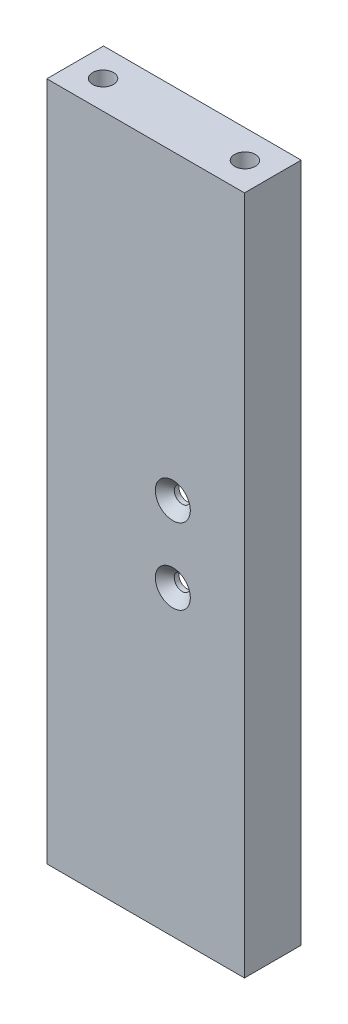
ISO-10303-21;
HEADER;
FILE_DESCRIPTION(('STEP AP214'),'2;1');
FILE_NAME('part.step','',(''),(''),'','','');
FILE_SCHEMA(('AUTOMOTIVE_DESIGN { 1 0 10303 214 1 1 1 1 }'));
ENDSEC;
DATA;
#1=APPLICATION_CONTEXT('core data for automotive mechanical design processes');
#2=APPLICATION_PROTOCOL_DEFINITION('international standard','automotive_design',2000,#1);
#3=PRODUCT_CONTEXT('',#1,'mechanical');
#4=PRODUCT('Part','Part','',(#3));
#5=PRODUCT_RELATED_PRODUCT_CATEGORY('part','',(#4));
#6=PRODUCT_DEFINITION_FORMATION('','',#4);
#7=PRODUCT_DEFINITION_CONTEXT('part definition',#1,'design');
#8=PRODUCT_DEFINITION('design','',#6,#7);
#9=PRODUCT_DEFINITION_SHAPE('','',#8);
#10=(LENGTH_UNIT() NAMED_UNIT(*) SI_UNIT(.MILLI.,.METRE.));
#11=(NAMED_UNIT(*) PLANE_ANGLE_UNIT() SI_UNIT($,.RADIAN.));
#12=(NAMED_UNIT(*) SI_UNIT($,.STERADIAN.) SOLID_ANGLE_UNIT());
#13=UNCERTAINTY_MEASURE_WITH_UNIT(LENGTH_MEASURE(1.E-05),#10,'distance_accuracy_value','');
#14=(GEOMETRIC_REPRESENTATION_CONTEXT(3) GLOBAL_UNCERTAINTY_ASSIGNED_CONTEXT((#13)) GLOBAL_UNIT_ASSIGNED_CONTEXT((#10,
#11,#12)) REPRESENTATION_CONTEXT('',''));
#15=CARTESIAN_POINT('',(0.,0.,0.));
#16=DIRECTION('',(0.,0.,1.));
#17=DIRECTION('',(1.,0.,0.));
#18=AXIS2_PLACEMENT_3D('',#15,#16,#17);
#19=CARTESIAN_POINT('',(0.,0.,-12.));
#20=DIRECTION('',(0.,0.,-1.));
#21=DIRECTION('',(-1.,0.,0.));
#22=AXIS2_PLACEMENT_3D('',#19,#20,#21);
#23=PLANE('',#22);
#24=DIRECTION('',(0.,-1.,0.));
#25=VECTOR('',#24,1.);
#26=CARTESIAN_POINT('',(-20.9,0.,-12.));
#27=LINE('',#26,#25);
#28=CARTESIAN_POINT('',(-20.9000000000001,143.8,-12.));
#29=VERTEX_POINT('',#28);
#30=CARTESIAN_POINT('',(-20.9,0.,-12.));
#31=VERTEX_POINT('',#30);
#32=EDGE_CURVE('E160',#29,#31,#27,.T.);
#33=ORIENTED_EDGE('',*,*,#32,.F.);
#34=DIRECTION('',(-1.,0.,0.));
#35=VECTOR('',#34,1.);
#36=CARTESIAN_POINT('',(-20.9000000000001,143.8,-12.));
#37=LINE('',#36,#35);
#38=CARTESIAN_POINT('',(20.9,143.8,-12.));
#39=VERTEX_POINT('',#38);
#40=EDGE_CURVE('E168',#39,#29,#37,.T.);
#41=ORIENTED_EDGE('',*,*,#40,.F.);
#42=DIRECTION('',(0.,1.,0.));
#43=VECTOR('',#42,1.);
#44=CARTESIAN_POINT('',(20.9,0.,-12.));
#45=LINE('',#44,#43);
#46=CARTESIAN_POINT('',(20.9,0.,-12.));
#47=VERTEX_POINT('',#46);
#48=EDGE_CURVE('E165',#47,#39,#45,.T.);
#49=ORIENTED_EDGE('',*,*,#48,.F.);
#50=DIRECTION('',(1.,0.,0.));
#51=VECTOR('',#50,1.);
#52=CARTESIAN_POINT('',(-20.9,0.,-12.));
#53=LINE('',#52,#51);
#54=EDGE_CURVE('E162',#31,#47,#53,.T.);
#55=ORIENTED_EDGE('',*,*,#54,.F.);
#56=EDGE_LOOP('',(#33,#41,#49,#55));
#57=FACE_BOUND('',#56,.T.);
#58=DIRECTION('',(-1.,0.,0.));
#59=VECTOR('',#58,1.);
#60=CARTESIAN_POINT('',(-20.9000000000001,136.8,-12.));
#61=LINE('',#60,#59);
#62=CARTESIAN_POINT('',(13.9,136.8,-12.));
#63=VERTEX_POINT('',#62);
#64=CARTESIAN_POINT('',(-13.9000000000001,136.8,-12.));
#65=VERTEX_POINT('',#64);
#66=EDGE_CURVE('E155',#63,#65,#61,.T.);
#67=ORIENTED_EDGE('',*,*,#66,.T.);
#68=DIRECTION('',(0.,-1.,0.));
#69=VECTOR('',#68,1.);
#70=CARTESIAN_POINT('',(-13.9,0.,-12.));
#71=LINE('',#70,#69);
#72=CARTESIAN_POINT('',(-13.9,7.,-12.));
#73=VERTEX_POINT('',#72);
#74=EDGE_CURVE('E123',#65,#73,#71,.T.);
#75=ORIENTED_EDGE('',*,*,#74,.T.);
#76=DIRECTION('',(1.,0.,0.));
#77=VECTOR('',#76,1.);
#78=CARTESIAN_POINT('',(-20.9,7.,-12.));
#79=LINE('',#78,#77);
#80=CARTESIAN_POINT('',(13.9,7.00000000000001,-12.));
#81=VERTEX_POINT('',#80);
#82=EDGE_CURVE('E145',#73,#81,#79,.T.);
#83=ORIENTED_EDGE('',*,*,#82,.T.);
#84=DIRECTION('',(0.,1.,0.));
#85=VECTOR('',#84,1.);
#86=CARTESIAN_POINT('',(13.9,0.,-12.));
#87=LINE('',#86,#85);
#88=EDGE_CURVE('E59',#81,#63,#87,.T.);
#89=ORIENTED_EDGE('',*,*,#88,.T.);
#90=EDGE_LOOP('',(#67,#75,#83,#89));
#91=FACE_BOUND('',#90,.T.);
#92=ADVANCED_FACE('F43',(#57,#91),#23,.T.);
#93=CARTESIAN_POINT('',(-20.9,0.,-12.));
#94=DIRECTION('',(-1.,0.,0.));
#95=DIRECTION('',(0.,-1.,0.));
#96=AXIS2_PLACEMENT_3D('',#93,#94,#95);
#97=PLANE('',#96);
#98=CARTESIAN_POINT('',(-20.9,129.4,-6.00000000000002));
#99=DIRECTION('',(-1.,0.,0.));
#100=DIRECTION('',(0.,0.,1.));
#101=AXIS2_PLACEMENT_3D('',#98,#99,#100);
#102=CIRCLE('',#101,2.20000000000001);
#103=CARTESIAN_POINT('',(-20.9,129.4,-3.80000000000001));
#104=VERTEX_POINT('',#103);
#105=EDGE_CURVE('E258',#104,#104,#102,.T.);
#106=ORIENTED_EDGE('',*,*,#105,.F.);
#107=EDGE_LOOP('',(#106));
#108=FACE_BOUND('',#107,.T.);
#109=CARTESIAN_POINT('',(-20.9,14.4000000000001,-6.));
#110=DIRECTION('',(-1.,0.,0.));
#111=DIRECTION('',(0.,0.,1.));
#112=AXIS2_PLACEMENT_3D('',#109,#110,#111);
#113=CIRCLE('',#112,2.2);
#114=CARTESIAN_POINT('',(-20.9,14.4000000000001,-3.8));
#115=VERTEX_POINT('',#114);
#116=EDGE_CURVE('E261',#115,#115,#113,.T.);
#117=ORIENTED_EDGE('',*,*,#116,.F.);
#118=EDGE_LOOP('',(#117));
#119=FACE_BOUND('',#118,.T.);
#120=DIRECTION('',(0.,-1.,0.));
#121=VECTOR('',#120,1.);
#122=CARTESIAN_POINT('',(-20.9,0.,0.));
#123=LINE('',#122,#121);
#124=CARTESIAN_POINT('',(-20.9000000000001,143.8,0.));
#125=VERTEX_POINT('',#124);
#126=CARTESIAN_POINT('',(-20.9,0.,0.));
#127=VERTEX_POINT('',#126);
#128=EDGE_CURVE('E128',#125,#127,#123,.T.);
#129=ORIENTED_EDGE('',*,*,#128,.F.);
#130=DIRECTION('',(0.,0.,1.));
#131=VECTOR('',#130,1.);
#132=CARTESIAN_POINT('',(-20.9000000000001,143.8,-12.));
#133=LINE('',#132,#131);
#134=EDGE_CURVE('E68',#29,#125,#133,.T.);
#135=ORIENTED_EDGE('',*,*,#134,.F.);
#136=ORIENTED_EDGE('',*,*,#32,.T.);
#137=DIRECTION('',(0.,0.,1.));
#138=VECTOR('',#137,1.);
#139=CARTESIAN_POINT('',(-20.9,0.,-12.));
#140=LINE('',#139,#138);
#141=EDGE_CURVE('E94',#31,#127,#140,.T.);
#142=ORIENTED_EDGE('',*,*,#141,.T.);
#143=EDGE_LOOP('',(#129,#135,#136,#142));
#144=FACE_BOUND('',#143,.T.);
#145=ADVANCED_FACE('F209',(#108,#119,#144),#97,.T.);
#146=CARTESIAN_POINT('',(-20.9000000000001,143.8,-12.));
#147=DIRECTION('',(0.,1.,0.));
#148=DIRECTION('',(0.,0.,1.));
#149=AXIS2_PLACEMENT_3D('',#146,#147,#148);
#150=PLANE('',#149);
#151=CARTESIAN_POINT('',(15.,143.8,-6.00000000000045));
#152=DIRECTION('',(0.,1.,0.));
#153=DIRECTION('',(0.,0.,1.));
#154=AXIS2_PLACEMENT_3D('',#151,#152,#153);
#155=CIRCLE('',#154,2.2);
#156=CARTESIAN_POINT('',(15.,143.8,-3.80000000000044));
#157=VERTEX_POINT('',#156);
#158=EDGE_CURVE('E287',#157,#157,#155,.T.);
#159=ORIENTED_EDGE('',*,*,#158,.F.);
#160=EDGE_LOOP('',(#159));
#161=FACE_BOUND('',#160,.T.);
#162=CARTESIAN_POINT('',(-15.,143.8,-6.00000000000044));
#163=DIRECTION('',(0.,1.,0.));
#164=DIRECTION('',(0.,0.,1.));
#165=AXIS2_PLACEMENT_3D('',#162,#163,#164);
#166=CIRCLE('',#165,2.2);
#167=CARTESIAN_POINT('',(-15.,143.8,-3.80000000000044));
#168=VERTEX_POINT('',#167);
#169=EDGE_CURVE('E290',#168,#168,#166,.T.);
#170=ORIENTED_EDGE('',*,*,#169,.F.);
#171=EDGE_LOOP('',(#170));
#172=FACE_BOUND('',#171,.T.);
#173=DIRECTION('',(-1.,0.,0.));
#174=VECTOR('',#173,1.);
#175=CARTESIAN_POINT('',(-20.9000000000001,143.8,0.));
#176=LINE('',#175,#174);
#177=CARTESIAN_POINT('',(20.9,143.8,0.));
#178=VERTEX_POINT('',#177);
#179=EDGE_CURVE('E163',#178,#125,#176,.T.);
#180=ORIENTED_EDGE('',*,*,#179,.F.);
#181=DIRECTION('',(0.,0.,1.));
#182=VECTOR('',#181,1.);
#183=CARTESIAN_POINT('',(20.9,143.8,-12.));
#184=LINE('',#183,#182);
#185=EDGE_CURVE('E182',#39,#178,#184,.T.);
#186=ORIENTED_EDGE('',*,*,#185,.F.);
#187=ORIENTED_EDGE('',*,*,#40,.T.);
#188=ORIENTED_EDGE('',*,*,#134,.T.);
#189=EDGE_LOOP('',(#180,#186,#187,#188));
#190=FACE_BOUND('',#189,.T.);
#191=ADVANCED_FACE('F214',(#161,#172,#190),#150,.T.);
#192=CARTESIAN_POINT('',(20.9,0.,-12.));
#193=DIRECTION('',(1.,0.,0.));
#194=DIRECTION('',(0.,1.,0.));
#195=AXIS2_PLACEMENT_3D('',#192,#193,#194);
#196=PLANE('',#195);
#197=DIRECTION('',(0.,1.,0.));
#198=VECTOR('',#197,1.);
#199=CARTESIAN_POINT('',(20.9,0.,0.));
#200=LINE('',#199,#198);
#201=CARTESIAN_POINT('',(20.9,0.,0.));
#202=VERTEX_POINT('',#201);
#203=EDGE_CURVE('E175',#202,#178,#200,.T.);
#204=ORIENTED_EDGE('',*,*,#203,.F.);
#205=DIRECTION('',(0.,0.,1.));
#206=VECTOR('',#205,1.);
#207=CARTESIAN_POINT('',(20.9,0.,-12.));
#208=LINE('',#207,#206);
#209=EDGE_CURVE('E184',#47,#202,#208,.T.);
#210=ORIENTED_EDGE('',*,*,#209,.F.);
#211=ORIENTED_EDGE('',*,*,#48,.T.);
#212=ORIENTED_EDGE('',*,*,#185,.T.);
#213=EDGE_LOOP('',(#204,#210,#211,#212));
#214=FACE_BOUND('',#213,.T.);
#215=ADVANCED_FACE('F213',(#214),#196,.T.);
#216=CARTESIAN_POINT('',(-20.9,0.,-12.));
#217=DIRECTION('',(0.,-1.,0.));
#218=DIRECTION('',(1.,0.,0.));
#219=AXIS2_PLACEMENT_3D('',#216,#217,#218);
#220=PLANE('',#219);
#221=CARTESIAN_POINT('',(15.,0.,-6.00000000000045));
#222=DIRECTION('',(0.,1.,0.));
#223=DIRECTION('',(0.,0.,1.));
#224=AXIS2_PLACEMENT_3D('',#221,#222,#223);
#225=CIRCLE('',#224,2.2);
#226=CARTESIAN_POINT('',(15.,0.,-3.80000000000044));
#227=VERTEX_POINT('',#226);
#228=EDGE_CURVE('E276',#227,#227,#225,.T.);
#229=ORIENTED_EDGE('',*,*,#228,.T.);
#230=EDGE_LOOP('',(#229));
#231=FACE_BOUND('',#230,.T.);
#232=CARTESIAN_POINT('',(-15.,0.,-6.00000000000044));
#233=DIRECTION('',(0.,1.,0.));
#234=DIRECTION('',(0.,0.,1.));
#235=AXIS2_PLACEMENT_3D('',#232,#233,#234);
#236=CIRCLE('',#235,2.2);
#237=CARTESIAN_POINT('',(-15.,0.,-3.80000000000044));
#238=VERTEX_POINT('',#237);
#239=EDGE_CURVE('E282',#238,#238,#236,.T.);
#240=ORIENTED_EDGE('',*,*,#239,.T.);
#241=EDGE_LOOP('',(#240));
#242=FACE_BOUND('',#241,.T.);
#243=DIRECTION('',(1.,0.,0.));
#244=VECTOR('',#243,1.);
#245=CARTESIAN_POINT('',(-20.9,0.,0.));
#246=LINE('',#245,#244);
#247=EDGE_CURVE('E172',#127,#202,#246,.T.);
#248=ORIENTED_EDGE('',*,*,#247,.F.);
#249=ORIENTED_EDGE('',*,*,#141,.F.);
#250=ORIENTED_EDGE('',*,*,#54,.T.);
#251=ORIENTED_EDGE('',*,*,#209,.T.);
#252=EDGE_LOOP('',(#248,#249,#250,#251));
#253=FACE_BOUND('',#252,.T.);
#254=ADVANCED_FACE('F205',(#231,#242,#253),#220,.T.);
#255=CARTESIAN_POINT('',(0.,0.,0.));
#256=DIRECTION('',(0.,0.,-1.));
#257=DIRECTION('',(-1.,0.,0.));
#258=AXIS2_PLACEMENT_3D('',#255,#256,#257);
#259=PLANE('',#258);
#260=CARTESIAN_POINT('',(5.75000000000001,63.9,0.));
#261=DIRECTION('',(0.,0.,-1.));
#262=DIRECTION('',(-1.,0.,0.));
#263=AXIS2_PLACEMENT_3D('',#260,#261,#262);
#264=CIRCLE('',#263,3.69999999999998);
#265=CARTESIAN_POINT('',(2.05000000000003,63.9,0.));
#266=VERTEX_POINT('',#265);
#267=EDGE_CURVE('E189',#266,#266,#264,.T.);
#268=ORIENTED_EDGE('',*,*,#267,.T.);
#269=EDGE_LOOP('',(#268));
#270=FACE_BOUND('',#269,.T.);
#271=CARTESIAN_POINT('',(5.75000000000001,79.9,0.));
#272=DIRECTION('',(0.,0.,-1.));
#273=DIRECTION('',(-1.,0.,0.));
#274=AXIS2_PLACEMENT_3D('',#271,#272,#273);
#275=CIRCLE('',#274,3.69999999999998);
#276=CARTESIAN_POINT('',(2.05000000000003,79.9,0.));
#277=VERTEX_POINT('',#276);
#278=EDGE_CURVE('E181',#277,#277,#275,.T.);
#279=ORIENTED_EDGE('',*,*,#278,.T.);
#280=EDGE_LOOP('',(#279));
#281=FACE_BOUND('',#280,.T.);
#282=ORIENTED_EDGE('',*,*,#128,.T.);
#283=ORIENTED_EDGE('',*,*,#247,.T.);
#284=ORIENTED_EDGE('',*,*,#203,.T.);
#285=ORIENTED_EDGE('',*,*,#179,.T.);
#286=EDGE_LOOP('',(#282,#283,#284,#285));
#287=FACE_BOUND('',#286,.T.);
#288=ADVANCED_FACE('F202',(#270,#281,#287),#259,.F.);
#289=CARTESIAN_POINT('',(-13.9,0.,-12.));
#290=DIRECTION('',(-1.,0.,0.));
#291=DIRECTION('',(0.,-1.,0.));
#292=AXIS2_PLACEMENT_3D('',#289,#290,#291);
#293=PLANE('',#292);
#294=DIRECTION('',(0.,-1.,0.));
#295=VECTOR('',#294,1.);
#296=CARTESIAN_POINT('',(-13.9,0.,-3.));
#297=LINE('',#296,#295);
#298=CARTESIAN_POINT('',(-13.9000000000001,136.8,-3.));
#299=VERTEX_POINT('',#298);
#300=CARTESIAN_POINT('',(-13.9,7.,-3.));
#301=VERTEX_POINT('',#300);
#302=EDGE_CURVE('E121',#299,#301,#297,.T.);
#303=ORIENTED_EDGE('',*,*,#302,.T.);
#304=DIRECTION('',(0.,0.,1.));
#305=VECTOR('',#304,1.);
#306=CARTESIAN_POINT('',(-13.9,7.,-12.));
#307=LINE('',#306,#305);
#308=EDGE_CURVE('E150',#73,#301,#307,.T.);
#309=ORIENTED_EDGE('',*,*,#308,.F.);
#310=ORIENTED_EDGE('',*,*,#74,.F.);
#311=DIRECTION('',(0.,0.,1.));
#312=VECTOR('',#311,1.);
#313=CARTESIAN_POINT('',(-13.9,136.8,-12.));
#314=LINE('',#313,#312);
#315=EDGE_CURVE('E118',#65,#299,#314,.T.);
#316=ORIENTED_EDGE('',*,*,#315,.T.);
#317=EDGE_LOOP('',(#303,#309,#310,#316));
#318=FACE_BOUND('',#317,.T.);
#319=ADVANCED_FACE('F120',(#318),#293,.F.);
#320=CARTESIAN_POINT('',(-20.9000000000001,136.8,-12.));
#321=DIRECTION('',(0.,1.,0.));
#322=DIRECTION('',(0.,0.,1.));
#323=AXIS2_PLACEMENT_3D('',#320,#321,#322);
#324=PLANE('',#323);
#325=DIRECTION('',(-1.,0.,0.));
#326=VECTOR('',#325,1.);
#327=CARTESIAN_POINT('',(-20.9000000000001,136.8,-3.));
#328=LINE('',#327,#326);
#329=CARTESIAN_POINT('',(13.9,136.8,-3.));
#330=VERTEX_POINT('',#329);
#331=EDGE_CURVE('E136',#330,#299,#328,.T.);
#332=ORIENTED_EDGE('',*,*,#331,.T.);
#333=ORIENTED_EDGE('',*,*,#315,.F.);
#334=ORIENTED_EDGE('',*,*,#66,.F.);
#335=DIRECTION('',(0.,0.,1.));
#336=VECTOR('',#335,1.);
#337=CARTESIAN_POINT('',(13.9,136.8,-12.));
#338=LINE('',#337,#336);
#339=EDGE_CURVE('E129',#63,#330,#338,.T.);
#340=ORIENTED_EDGE('',*,*,#339,.T.);
#341=EDGE_LOOP('',(#332,#333,#334,#340));
#342=FACE_BOUND('',#341,.T.);
#343=ADVANCED_FACE('F141',(#342),#324,.F.);
#344=CARTESIAN_POINT('',(13.9,0.,-12.));
#345=DIRECTION('',(1.,0.,0.));
#346=DIRECTION('',(0.,1.,0.));
#347=AXIS2_PLACEMENT_3D('',#344,#345,#346);
#348=PLANE('',#347);
#349=DIRECTION('',(0.,1.,0.));
#350=VECTOR('',#349,1.);
#351=CARTESIAN_POINT('',(13.9,0.,-3.));
#352=LINE('',#351,#350);
#353=CARTESIAN_POINT('',(13.9,7.00000000000001,-3.));
#354=VERTEX_POINT('',#353);
#355=EDGE_CURVE('E143',#354,#330,#352,.T.);
#356=ORIENTED_EDGE('',*,*,#355,.T.);
#357=ORIENTED_EDGE('',*,*,#339,.F.);
#358=ORIENTED_EDGE('',*,*,#88,.F.);
#359=DIRECTION('',(0.,0.,1.));
#360=VECTOR('',#359,1.);
#361=CARTESIAN_POINT('',(13.9,7.00000000000001,-12.));
#362=LINE('',#361,#360);
#363=EDGE_CURVE('E151',#81,#354,#362,.T.);
#364=ORIENTED_EDGE('',*,*,#363,.T.);
#365=EDGE_LOOP('',(#356,#357,#358,#364));
#366=FACE_BOUND('',#365,.T.);
#367=ADVANCED_FACE('F223',(#366),#348,.F.);
#368=CARTESIAN_POINT('',(-20.9,7.,-12.));
#369=DIRECTION('',(0.,-1.,0.));
#370=DIRECTION('',(1.,0.,0.));
#371=AXIS2_PLACEMENT_3D('',#368,#369,#370);
#372=PLANE('',#371);
#373=DIRECTION('',(1.,0.,0.));
#374=VECTOR('',#373,1.);
#375=CARTESIAN_POINT('',(-20.9,7.,-3.));
#376=LINE('',#375,#374);
#377=EDGE_CURVE('E138',#301,#354,#376,.T.);
#378=ORIENTED_EDGE('',*,*,#377,.T.);
#379=ORIENTED_EDGE('',*,*,#363,.F.);
#380=ORIENTED_EDGE('',*,*,#82,.F.);
#381=ORIENTED_EDGE('',*,*,#308,.T.);
#382=EDGE_LOOP('',(#378,#379,#380,#381));
#383=FACE_BOUND('',#382,.T.);
#384=ADVANCED_FACE('F222',(#383),#372,.F.);
#385=CARTESIAN_POINT('',(0.,0.,-3.));
#386=DIRECTION('',(0.,0.,-1.));
#387=DIRECTION('',(-1.,0.,0.));
#388=AXIS2_PLACEMENT_3D('',#385,#386,#387);
#389=PLANE('',#388);
#390=CARTESIAN_POINT('',(5.75000000000001,63.9,-3.));
#391=DIRECTION('',(0.,0.,-1.));
#392=DIRECTION('',(-1.,0.,0.));
#393=AXIS2_PLACEMENT_3D('',#390,#391,#392);
#394=CIRCLE('',#393,1.70000000000001);
#395=CARTESIAN_POINT('',(4.05000000000001,63.9,-3.));
#396=VERTEX_POINT('',#395);
#397=EDGE_CURVE('E268',#396,#396,#394,.T.);
#398=ORIENTED_EDGE('',*,*,#397,.F.);
#399=EDGE_LOOP('',(#398));
#400=FACE_BOUND('',#399,.T.);
#401=CARTESIAN_POINT('',(5.75000000000001,79.9,-3.));
#402=DIRECTION('',(0.,0.,-1.));
#403=DIRECTION('',(-1.,0.,0.));
#404=AXIS2_PLACEMENT_3D('',#401,#402,#403);
#405=CIRCLE('',#404,1.70000000000001);
#406=CARTESIAN_POINT('',(4.05000000000001,79.9,-3.));
#407=VERTEX_POINT('',#406);
#408=EDGE_CURVE('E571',#407,#407,#405,.T.);
#409=ORIENTED_EDGE('',*,*,#408,.F.);
#410=EDGE_LOOP('',(#409));
#411=FACE_BOUND('',#410,.T.);
#412=ORIENTED_EDGE('',*,*,#302,.F.);
#413=ORIENTED_EDGE('',*,*,#331,.F.);
#414=ORIENTED_EDGE('',*,*,#355,.F.);
#415=ORIENTED_EDGE('',*,*,#377,.F.);
#416=EDGE_LOOP('',(#412,#413,#414,#415));
#417=FACE_BOUND('',#416,.T.);
#418=ADVANCED_FACE('F134',(#400,#411,#417),#389,.T.);
#419=CARTESIAN_POINT('',(-15.,138.6,-6.00000000000044));
#420=DIRECTION('',(0.,1.,0.));
#421=DIRECTION('',(0.,0.,1.));
#422=AXIS2_PLACEMENT_3D('',#419,#420,#421);
#423=CYLINDRICAL_SURFACE('',#422,2.2);
#424=CARTESIAN_POINT('',(-15.,138.6,-6.00000000000044));
#425=DIRECTION('',(0.,1.,0.));
#426=DIRECTION('',(0.,0.,1.));
#427=AXIS2_PLACEMENT_3D('',#424,#425,#426);
#428=CIRCLE('',#427,2.2);
#429=CARTESIAN_POINT('',(-15.,138.6,-3.80000000000044));
#430=VERTEX_POINT('',#429);
#431=EDGE_CURVE('E275',#430,#430,#428,.T.);
#432=ORIENTED_EDGE('',*,*,#431,.F.);
#433=EDGE_LOOP('',(#432));
#434=FACE_BOUND('',#433,.T.);
#435=ORIENTED_EDGE('',*,*,#169,.T.);
#436=EDGE_LOOP('',(#435));
#437=FACE_BOUND('',#436,.T.);
#438=ADVANCED_FACE('F235',(#434,#437),#423,.F.);
#439=CARTESIAN_POINT('',(-15.,138.6,-6.00000000000044));
#440=DIRECTION('',(0.,1.,0.));
#441=DIRECTION('',(0.,0.,1.));
#442=AXIS2_PLACEMENT_3D('',#439,#440,#441);
#443=PLANE('',#442);
#444=ORIENTED_EDGE('',*,*,#431,.T.);
#445=EDGE_LOOP('',(#444));
#446=FACE_BOUND('',#445,.T.);
#447=ADVANCED_FACE('F296',(#446),#443,.T.);
#448=CARTESIAN_POINT('',(15.,138.6,-6.00000000000045));
#449=DIRECTION('',(0.,1.,0.));
#450=DIRECTION('',(0.,0.,1.));
#451=AXIS2_PLACEMENT_3D('',#448,#449,#450);
#452=CYLINDRICAL_SURFACE('',#451,2.2);
#453=CARTESIAN_POINT('',(15.,138.6,-6.00000000000045));
#454=DIRECTION('',(0.,1.,0.));
#455=DIRECTION('',(0.,0.,1.));
#456=AXIS2_PLACEMENT_3D('',#453,#454,#455);
#457=CIRCLE('',#456,2.2);
#458=CARTESIAN_POINT('',(15.,138.6,-3.80000000000044));
#459=VERTEX_POINT('',#458);
#460=EDGE_CURVE('E139',#459,#459,#457,.T.);
#461=ORIENTED_EDGE('',*,*,#460,.F.);
#462=EDGE_LOOP('',(#461));
#463=FACE_BOUND('',#462,.T.);
#464=ORIENTED_EDGE('',*,*,#158,.T.);
#465=EDGE_LOOP('',(#464));
#466=FACE_BOUND('',#465,.T.);
#467=ADVANCED_FACE('F306',(#463,#466),#452,.F.);
#468=CARTESIAN_POINT('',(15.,138.6,-6.00000000000045));
#469=DIRECTION('',(0.,1.,0.));
#470=DIRECTION('',(0.,0.,1.));
#471=AXIS2_PLACEMENT_3D('',#468,#469,#470);
#472=PLANE('',#471);
#473=ORIENTED_EDGE('',*,*,#460,.T.);
#474=EDGE_LOOP('',(#473));
#475=FACE_BOUND('',#474,.T.);
#476=ADVANCED_FACE('F364',(#475),#472,.T.);
#477=CARTESIAN_POINT('',(-15.,5.2,-6.00000000000044));
#478=DIRECTION('',(0.,-1.,0.));
#479=DIRECTION('',(0.,0.,-1.));
#480=AXIS2_PLACEMENT_3D('',#477,#478,#479);
#481=CYLINDRICAL_SURFACE('',#480,2.2);
#482=CARTESIAN_POINT('',(-15.,5.2,-6.00000000000044));
#483=DIRECTION('',(0.,1.,0.));
#484=DIRECTION('',(0.,0.,1.));
#485=AXIS2_PLACEMENT_3D('',#482,#483,#484);
#486=CIRCLE('',#485,2.2);
#487=CARTESIAN_POINT('',(-15.,5.2,-3.80000000000044));
#488=VERTEX_POINT('',#487);
#489=EDGE_CURVE('E279',#488,#488,#486,.T.);
#490=ORIENTED_EDGE('',*,*,#489,.T.);
#491=EDGE_LOOP('',(#490));
#492=FACE_BOUND('',#491,.T.);
#493=ORIENTED_EDGE('',*,*,#239,.F.);
#494=EDGE_LOOP('',(#493));
#495=FACE_BOUND('',#494,.T.);
#496=ADVANCED_FACE('F374',(#492,#495),#481,.F.);
#497=CARTESIAN_POINT('',(-15.,5.2,-6.00000000000044));
#498=DIRECTION('',(0.,-1.,0.));
#499=DIRECTION('',(0.,0.,1.));
#500=AXIS2_PLACEMENT_3D('',#497,#498,#499);
#501=PLANE('',#500);
#502=ORIENTED_EDGE('',*,*,#489,.F.);
#503=EDGE_LOOP('',(#502));
#504=FACE_BOUND('',#503,.T.);
#505=ADVANCED_FACE('F392',(#504),#501,.T.);
#506=CARTESIAN_POINT('',(15.,5.2,-6.00000000000045));
#507=DIRECTION('',(0.,-1.,0.));
#508=DIRECTION('',(0.,0.,-1.));
#509=AXIS2_PLACEMENT_3D('',#506,#507,#508);
#510=CYLINDRICAL_SURFACE('',#509,2.2);
#511=CARTESIAN_POINT('',(15.,5.2,-6.00000000000045));
#512=DIRECTION('',(0.,1.,0.));
#513=DIRECTION('',(0.,0.,1.));
#514=AXIS2_PLACEMENT_3D('',#511,#512,#513);
#515=CIRCLE('',#514,2.2);
#516=CARTESIAN_POINT('',(15.,5.2,-3.80000000000044));
#517=VERTEX_POINT('',#516);
#518=EDGE_CURVE('E272',#517,#517,#515,.T.);
#519=ORIENTED_EDGE('',*,*,#518,.T.);
#520=EDGE_LOOP('',(#519));
#521=FACE_BOUND('',#520,.T.);
#522=ORIENTED_EDGE('',*,*,#228,.F.);
#523=EDGE_LOOP('',(#522));
#524=FACE_BOUND('',#523,.T.);
#525=ADVANCED_FACE('F403',(#521,#524),#510,.F.);
#526=CARTESIAN_POINT('',(15.,5.2,-6.00000000000045));
#527=DIRECTION('',(0.,-1.,0.));
#528=DIRECTION('',(0.,0.,1.));
#529=AXIS2_PLACEMENT_3D('',#526,#527,#528);
#530=PLANE('',#529);
#531=ORIENTED_EDGE('',*,*,#518,.F.);
#532=EDGE_LOOP('',(#531));
#533=FACE_BOUND('',#532,.T.);
#534=ADVANCED_FACE('F414',(#533),#530,.T.);
#535=CARTESIAN_POINT('',(-15.7,14.4000000000001,-6.));
#536=DIRECTION('',(-1.,0.,0.));
#537=DIRECTION('',(0.,0.,1.));
#538=AXIS2_PLACEMENT_3D('',#535,#536,#537);
#539=CYLINDRICAL_SURFACE('',#538,2.2);
#540=CARTESIAN_POINT('',(-15.7,14.4000000000001,-6.));
#541=DIRECTION('',(-1.,0.,0.));
#542=DIRECTION('',(0.,0.,1.));
#543=AXIS2_PLACEMENT_3D('',#540,#541,#542);
#544=CIRCLE('',#543,2.2);
#545=CARTESIAN_POINT('',(-15.7,14.4000000000001,-3.8));
#546=VERTEX_POINT('',#545);
#547=EDGE_CURVE('E263',#546,#546,#544,.T.);
#548=ORIENTED_EDGE('',*,*,#547,.F.);
#549=EDGE_LOOP('',(#548));
#550=FACE_BOUND('',#549,.T.);
#551=ORIENTED_EDGE('',*,*,#116,.T.);
#552=EDGE_LOOP('',(#551));
#553=FACE_BOUND('',#552,.T.);
#554=ADVANCED_FACE('F424',(#550,#553),#539,.F.);
#555=CARTESIAN_POINT('',(-15.7,14.4000000000001,-6.));
#556=DIRECTION('',(-1.,0.,0.));
#557=DIRECTION('',(0.,0.,1.));
#558=AXIS2_PLACEMENT_3D('',#555,#556,#557);
#559=PLANE('',#558);
#560=ORIENTED_EDGE('',*,*,#547,.T.);
#561=EDGE_LOOP('',(#560));
#562=FACE_BOUND('',#561,.T.);
#563=ADVANCED_FACE('F440',(#562),#559,.T.);
#564=CARTESIAN_POINT('',(-15.7,129.4,-6.00000000000002));
#565=DIRECTION('',(-1.,0.,0.));
#566=DIRECTION('',(0.,0.,1.));
#567=AXIS2_PLACEMENT_3D('',#564,#565,#566);
#568=CYLINDRICAL_SURFACE('',#567,2.20000000000001);
#569=CARTESIAN_POINT('',(-15.7,129.4,-6.00000000000002));
#570=DIRECTION('',(-1.,0.,0.));
#571=DIRECTION('',(0.,0.,1.));
#572=AXIS2_PLACEMENT_3D('',#569,#570,#571);
#573=CIRCLE('',#572,2.20000000000001);
#574=CARTESIAN_POINT('',(-15.7,129.4,-3.80000000000001));
#575=VERTEX_POINT('',#574);
#576=EDGE_CURVE('E265',#575,#575,#573,.T.);
#577=ORIENTED_EDGE('',*,*,#576,.F.);
#578=EDGE_LOOP('',(#577));
#579=FACE_BOUND('',#578,.T.);
#580=ORIENTED_EDGE('',*,*,#105,.T.);
#581=EDGE_LOOP('',(#580));
#582=FACE_BOUND('',#581,.T.);
#583=ADVANCED_FACE('F451',(#579,#582),#568,.F.);
#584=CARTESIAN_POINT('',(-15.7,129.4,-6.00000000000002));
#585=DIRECTION('',(-1.,0.,0.));
#586=DIRECTION('',(0.,0.,1.));
#587=AXIS2_PLACEMENT_3D('',#584,#585,#586);
#588=PLANE('',#587);
#589=ORIENTED_EDGE('',*,*,#576,.T.);
#590=EDGE_LOOP('',(#589));
#591=FACE_BOUND('',#590,.T.);
#592=ADVANCED_FACE('F462',(#591),#588,.T.);
#593=CARTESIAN_POINT('',(5.75000000000001,79.9,7.));
#594=DIRECTION('',(0.,0.,-1.));
#595=DIRECTION('',(-1.,0.,0.));
#596=AXIS2_PLACEMENT_3D('',#593,#594,#595);
#597=CYLINDRICAL_SURFACE('',#596,1.70000000000001);
#598=CARTESIAN_POINT('',(5.75000000000001,79.9,-1.99999999999998));
#599=DIRECTION('',(0.,0.,-1.));
#600=DIRECTION('',(-1.,0.,0.));
#601=AXIS2_PLACEMENT_3D('',#598,#599,#600);
#602=CIRCLE('',#601,1.70000000000001);
#603=CARTESIAN_POINT('',(4.05000000000001,79.9,-1.99999999999998));
#604=VERTEX_POINT('',#603);
#605=EDGE_CURVE('E11',#604,#604,#602,.F.);
#606=ORIENTED_EDGE('',*,*,#605,.T.);
#607=EDGE_LOOP('',(#606));
#608=FACE_BOUND('',#607,.T.);
#609=ORIENTED_EDGE('',*,*,#408,.T.);
#610=EDGE_LOOP('',(#609));
#611=FACE_BOUND('',#610,.T.);
#612=ADVANCED_FACE('F473',(#608,#611),#597,.F.);
#613=CARTESIAN_POINT('',(5.75000000000001,63.9,7.));
#614=DIRECTION('',(0.,0.,-1.));
#615=DIRECTION('',(-1.,0.,0.));
#616=AXIS2_PLACEMENT_3D('',#613,#614,#615);
#617=CYLINDRICAL_SURFACE('',#616,1.70000000000001);
#618=CARTESIAN_POINT('',(5.75000000000001,63.9,-1.99999999999998));
#619=DIRECTION('',(0.,0.,-1.));
#620=DIRECTION('',(-1.,0.,0.));
#621=AXIS2_PLACEMENT_3D('',#618,#619,#620);
#622=CIRCLE('',#621,1.70000000000001);
#623=CARTESIAN_POINT('',(4.05000000000001,63.9,-1.99999999999998));
#624=VERTEX_POINT('',#623);
#625=EDGE_CURVE('E52',#624,#624,#622,.F.);
#626=ORIENTED_EDGE('',*,*,#625,.T.);
#627=EDGE_LOOP('',(#626));
#628=FACE_BOUND('',#627,.T.);
#629=ORIENTED_EDGE('',*,*,#397,.T.);
#630=EDGE_LOOP('',(#629));
#631=FACE_BOUND('',#630,.T.);
#632=ADVANCED_FACE('F194',(#628,#631),#617,.F.);
#633=CARTESIAN_POINT('',(5.75000000000001,63.9,0.));
#634=DIRECTION('',(0.,0.,1.));
#635=DIRECTION('',(1.,0.,0.));
#636=AXIS2_PLACEMENT_3D('',#633,#634,#635);
#637=CONICAL_SURFACE('',#636,3.69999999999998,0.785398163397446);
#638=ORIENTED_EDGE('',*,*,#625,.F.);
#639=EDGE_LOOP('',(#638));
#640=FACE_BOUND('',#639,.T.);
#641=ORIENTED_EDGE('',*,*,#267,.F.);
#642=EDGE_LOOP('',(#641));
#643=FACE_BOUND('',#642,.T.);
#644=ADVANCED_FACE('F197',(#640,#643),#637,.F.);
#645=CARTESIAN_POINT('',(5.75000000000001,79.9,0.));
#646=DIRECTION('',(0.,0.,1.));
#647=DIRECTION('',(1.,0.,0.));
#648=AXIS2_PLACEMENT_3D('',#645,#646,#647);
#649=CONICAL_SURFACE('',#648,3.69999999999998,0.785398163397446);
#650=ORIENTED_EDGE('',*,*,#605,.F.);
#651=EDGE_LOOP('',(#650));
#652=FACE_BOUND('',#651,.T.);
#653=ORIENTED_EDGE('',*,*,#278,.F.);
#654=EDGE_LOOP('',(#653));
#655=FACE_BOUND('',#654,.T.);
#656=ADVANCED_FACE('F46',(#652,#655),#649,.F.);
#657=CLOSED_SHELL('',(#92,#145,#191,#215,#254,#288,#319,#343,#367,#384,#418,#438,#447,#467,#476,
#496,#505,#525,#534,#554,#563,#583,#592,#612,#632,#644,#656));
#658=MANIFOLD_SOLID_BREP('B2',#657);
#659=ADVANCED_BREP_SHAPE_REPRESENTATION('',(#18,#658),#14);
#660=SHAPE_DEFINITION_REPRESENTATION(#9,#659);
ENDSEC;
END-ISO-10303-21;
